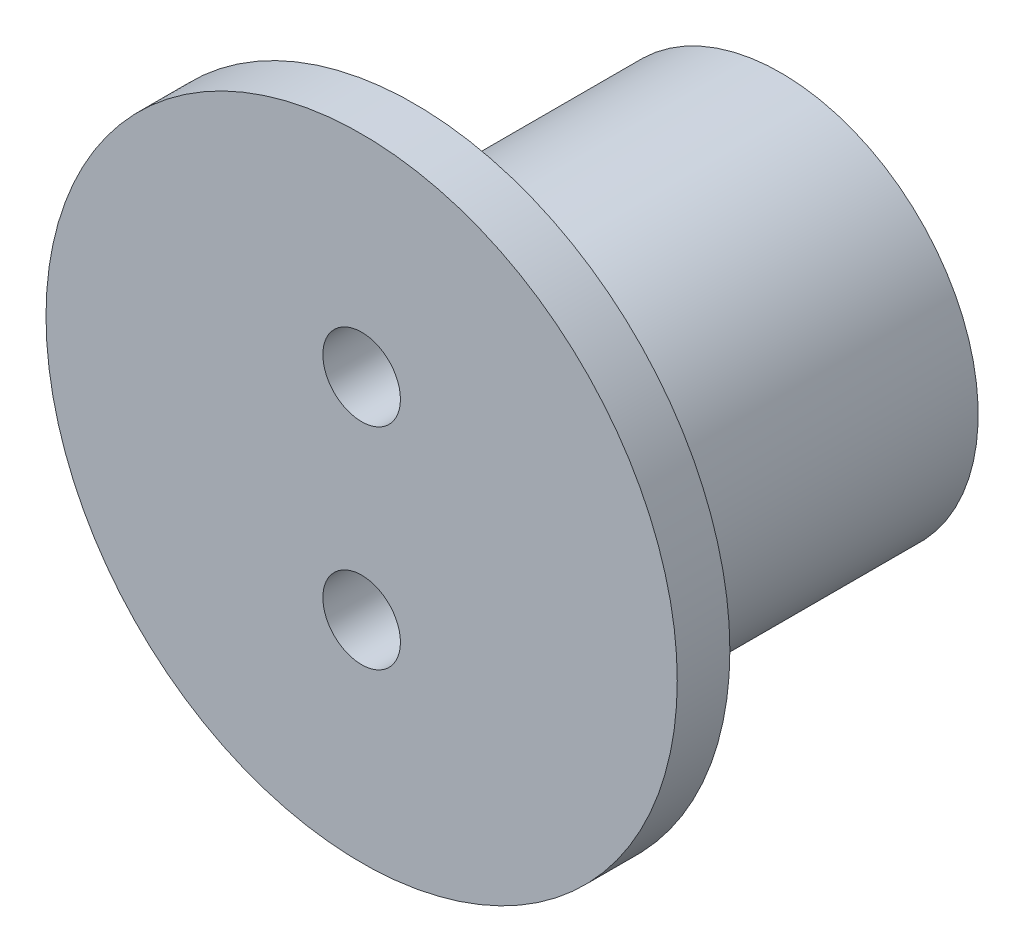
ISO-10303-21;
HEADER;
FILE_DESCRIPTION(('STEP AP214'),'2;1');
FILE_NAME('part.step','',(''),(''),'','','');
FILE_SCHEMA(('AUTOMOTIVE_DESIGN { 1 0 10303 214 1 1 1 1 }'));
ENDSEC;
DATA;
#1=APPLICATION_CONTEXT('core data for automotive mechanical design processes');
#2=APPLICATION_PROTOCOL_DEFINITION('international standard','automotive_design',2000,#1);
#3=PRODUCT_CONTEXT('',#1,'mechanical');
#4=PRODUCT('Part','Part','',(#3));
#5=PRODUCT_RELATED_PRODUCT_CATEGORY('part','',(#4));
#6=PRODUCT_DEFINITION_FORMATION('','',#4);
#7=PRODUCT_DEFINITION_CONTEXT('part definition',#1,'design');
#8=PRODUCT_DEFINITION('design','',#6,#7);
#9=PRODUCT_DEFINITION_SHAPE('','',#8);
#10=(LENGTH_UNIT() NAMED_UNIT(*) SI_UNIT(.MILLI.,.METRE.));
#11=(NAMED_UNIT(*) PLANE_ANGLE_UNIT() SI_UNIT($,.RADIAN.));
#12=(NAMED_UNIT(*) SI_UNIT($,.STERADIAN.) SOLID_ANGLE_UNIT());
#13=UNCERTAINTY_MEASURE_WITH_UNIT(LENGTH_MEASURE(1.E-05),#10,'distance_accuracy_value','');
#14=(GEOMETRIC_REPRESENTATION_CONTEXT(3) GLOBAL_UNCERTAINTY_ASSIGNED_CONTEXT((#13)) GLOBAL_UNIT_ASSIGNED_CONTEXT((#10,
#11,#12)) REPRESENTATION_CONTEXT('',''));
#15=CARTESIAN_POINT('',(0.,0.,0.));
#16=DIRECTION('',(0.,0.,1.));
#17=DIRECTION('',(1.,0.,0.));
#18=AXIS2_PLACEMENT_3D('',#15,#16,#17);
#19=CARTESIAN_POINT('',(0.,0.,2.));
#20=DIRECTION('',(0.,0.,-1.));
#21=DIRECTION('',(-1.,0.,0.));
#22=AXIS2_PLACEMENT_3D('',#19,#20,#21);
#23=CYLINDRICAL_SURFACE('',#22,12.);
#24=CARTESIAN_POINT('',(0.,0.,2.));
#25=DIRECTION('',(0.,0.,1.));
#26=DIRECTION('',(1.,0.,0.));
#27=AXIS2_PLACEMENT_3D('',#24,#25,#26);
#28=CIRCLE('',#27,12.);
#29=CARTESIAN_POINT('',(12.,0.,2.));
#30=VERTEX_POINT('',#29);
#31=EDGE_CURVE('E48',#30,#30,#28,.T.);
#32=ORIENTED_EDGE('',*,*,#31,.F.);
#33=EDGE_LOOP('',(#32));
#34=FACE_BOUND('',#33,.T.);
#35=CARTESIAN_POINT('',(0.,0.,0.));
#36=DIRECTION('',(0.,0.,1.));
#37=DIRECTION('',(1.,0.,0.));
#38=AXIS2_PLACEMENT_3D('',#35,#36,#37);
#39=CIRCLE('',#38,12.);
#40=CARTESIAN_POINT('',(12.,0.,0.));
#41=VERTEX_POINT('',#40);
#42=EDGE_CURVE('E53',#41,#41,#39,.T.);
#43=ORIENTED_EDGE('',*,*,#42,.T.);
#44=EDGE_LOOP('',(#43));
#45=FACE_BOUND('',#44,.T.);
#46=ADVANCED_FACE('F41',(#34,#45),#23,.T.);
#47=CARTESIAN_POINT('',(0.,0.,2.));
#48=DIRECTION('',(0.,0.,1.));
#49=DIRECTION('',(1.,0.,0.));
#50=AXIS2_PLACEMENT_3D('',#47,#48,#49);
#51=PLANE('',#50);
#52=CARTESIAN_POINT('',(0.,4.,2.));
#53=DIRECTION('',(0.,0.,1.));
#54=DIRECTION('',(1.,0.,0.));
#55=AXIS2_PLACEMENT_3D('',#52,#53,#54);
#56=CIRCLE('',#55,1.475);
#57=CARTESIAN_POINT('',(1.475,4.,2.));
#58=VERTEX_POINT('',#57);
#59=EDGE_CURVE('E62',#58,#58,#56,.T.);
#60=ORIENTED_EDGE('',*,*,#59,.F.);
#61=EDGE_LOOP('',(#60));
#62=FACE_BOUND('',#61,.T.);
#63=CARTESIAN_POINT('',(0.,-4.,2.));
#64=DIRECTION('',(0.,0.,1.));
#65=DIRECTION('',(1.,0.,0.));
#66=AXIS2_PLACEMENT_3D('',#63,#64,#65);
#67=CIRCLE('',#66,1.475);
#68=CARTESIAN_POINT('',(1.475,-4.,2.));
#69=VERTEX_POINT('',#68);
#70=EDGE_CURVE('E67',#69,#69,#67,.T.);
#71=ORIENTED_EDGE('',*,*,#70,.F.);
#72=EDGE_LOOP('',(#71));
#73=FACE_BOUND('',#72,.T.);
#74=ORIENTED_EDGE('',*,*,#31,.T.);
#75=EDGE_LOOP('',(#74));
#76=FACE_BOUND('',#75,.T.);
#77=ADVANCED_FACE('F76',(#62,#73,#76),#51,.T.);
#78=CARTESIAN_POINT('',(0.,0.,0.));
#79=DIRECTION('',(0.,0.,1.));
#80=DIRECTION('',(1.,0.,0.));
#81=AXIS2_PLACEMENT_3D('',#78,#79,#80);
#82=PLANE('',#81);
#83=CARTESIAN_POINT('',(1.94028500029066,0.485071250072666,0.));
#84=DIRECTION('',(0.,0.,-1.));
#85=DIRECTION('',(-1.,0.,0.));
#86=AXIS2_PLACEMENT_3D('',#83,#84,#85);
#87=CIRCLE('',#86,7.5);
#88=CARTESIAN_POINT('',(-5.55971499970934,0.485071250072666,0.));
#89=VERTEX_POINT('',#88);
#90=EDGE_CURVE('E10',#89,#89,#87,.T.);
#91=ORIENTED_EDGE('',*,*,#90,.F.);
#92=EDGE_LOOP('',(#91));
#93=FACE_BOUND('',#92,.T.);
#94=ORIENTED_EDGE('',*,*,#42,.F.);
#95=EDGE_LOOP('',(#94));
#96=FACE_BOUND('',#95,.T.);
#97=ADVANCED_FACE('F79',(#93,#96),#82,.F.);
#98=CARTESIAN_POINT('',(1.94028500029066,0.485071250072666,-12.));
#99=DIRECTION('',(0.,0.,1.));
#100=DIRECTION('',(1.,0.,0.));
#101=AXIS2_PLACEMENT_3D('',#98,#99,#100);
#102=CYLINDRICAL_SURFACE('',#101,7.5);
#103=CARTESIAN_POINT('',(1.94028500029066,0.485071250072666,-12.));
#104=DIRECTION('',(0.,0.,-1.));
#105=DIRECTION('',(-1.,0.,0.));
#106=AXIS2_PLACEMENT_3D('',#103,#104,#105);
#107=CIRCLE('',#106,7.5);
#108=CARTESIAN_POINT('',(-5.55971499970934,0.485071250072666,-12.));
#109=VERTEX_POINT('',#108);
#110=EDGE_CURVE('E56',#109,#109,#107,.T.);
#111=ORIENTED_EDGE('',*,*,#110,.F.);
#112=EDGE_LOOP('',(#111));
#113=FACE_BOUND('',#112,.T.);
#114=ORIENTED_EDGE('',*,*,#90,.T.);
#115=EDGE_LOOP('',(#114));
#116=FACE_BOUND('',#115,.T.);
#117=ADVANCED_FACE('F89',(#113,#116),#102,.T.);
#118=CARTESIAN_POINT('',(0.,0.,-12.));
#119=DIRECTION('',(0.,0.,-1.));
#120=DIRECTION('',(-1.,0.,0.));
#121=AXIS2_PLACEMENT_3D('',#118,#119,#120);
#122=PLANE('',#121);
#123=CARTESIAN_POINT('',(0.,4.,-12.));
#124=DIRECTION('',(0.,0.,-1.));
#125=DIRECTION('',(-1.,0.,0.));
#126=AXIS2_PLACEMENT_3D('',#123,#124,#125);
#127=CIRCLE('',#126,1.475);
#128=CARTESIAN_POINT('',(-1.475,4.,-12.));
#129=VERTEX_POINT('',#128);
#130=EDGE_CURVE('E44',#129,#129,#127,.T.);
#131=ORIENTED_EDGE('',*,*,#130,.F.);
#132=EDGE_LOOP('',(#131));
#133=FACE_BOUND('',#132,.T.);
#134=CARTESIAN_POINT('',(0.,-4.,-12.));
#135=DIRECTION('',(0.,0.,-1.));
#136=DIRECTION('',(-1.,0.,0.));
#137=AXIS2_PLACEMENT_3D('',#134,#135,#136);
#138=CIRCLE('',#137,1.475);
#139=CARTESIAN_POINT('',(-1.475,-4.,-12.));
#140=VERTEX_POINT('',#139);
#141=EDGE_CURVE('E60',#140,#140,#138,.T.);
#142=ORIENTED_EDGE('',*,*,#141,.F.);
#143=EDGE_LOOP('',(#142));
#144=FACE_BOUND('',#143,.T.);
#145=ORIENTED_EDGE('',*,*,#110,.T.);
#146=EDGE_LOOP('',(#145));
#147=FACE_BOUND('',#146,.T.);
#148=ADVANCED_FACE('F94',(#133,#144,#147),#122,.T.);
#149=CARTESIAN_POINT('',(0.,-4.,-16.));
#150=DIRECTION('',(0.,0.,1.));
#151=DIRECTION('',(1.,0.,0.));
#152=AXIS2_PLACEMENT_3D('',#149,#150,#151);
#153=CYLINDRICAL_SURFACE('',#152,1.475);
#154=ORIENTED_EDGE('',*,*,#141,.T.);
#155=EDGE_LOOP('',(#154));
#156=FACE_BOUND('',#155,.T.);
#157=ORIENTED_EDGE('',*,*,#70,.T.);
#158=EDGE_LOOP('',(#157));
#159=FACE_BOUND('',#158,.T.);
#160=ADVANCED_FACE('F74',(#156,#159),#153,.F.);
#161=CARTESIAN_POINT('',(0.,4.,-16.));
#162=DIRECTION('',(0.,0.,1.));
#163=DIRECTION('',(1.,0.,0.));
#164=AXIS2_PLACEMENT_3D('',#161,#162,#163);
#165=CYLINDRICAL_SURFACE('',#164,1.475);
#166=ORIENTED_EDGE('',*,*,#130,.T.);
#167=EDGE_LOOP('',(#166));
#168=FACE_BOUND('',#167,.T.);
#169=ORIENTED_EDGE('',*,*,#59,.T.);
#170=EDGE_LOOP('',(#169));
#171=FACE_BOUND('',#170,.T.);
#172=ADVANCED_FACE('F103',(#168,#171),#165,.F.);
#173=CLOSED_SHELL('',(#46,#77,#97,#117,#148,#160,#172));
#174=MANIFOLD_SOLID_BREP('B2',#173);
#175=ADVANCED_BREP_SHAPE_REPRESENTATION('',(#18,#174),#14);
#176=SHAPE_DEFINITION_REPRESENTATION(#9,#175);
ENDSEC;
END-ISO-10303-21;
